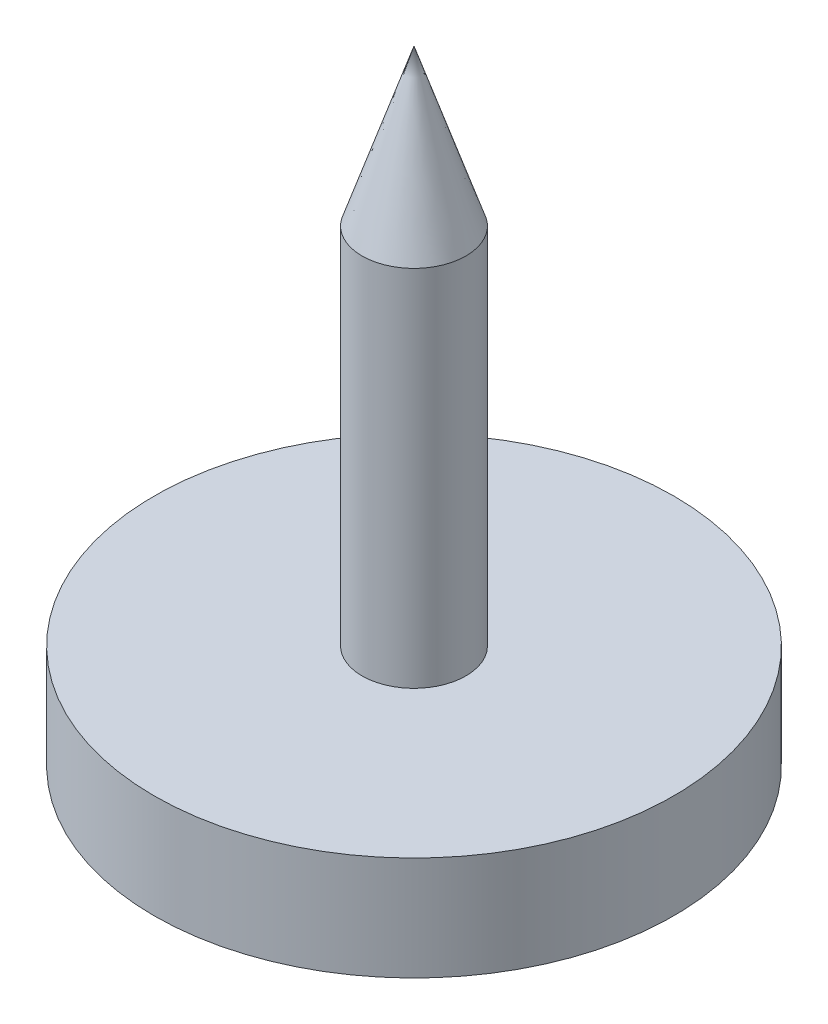
ISO-10303-21;
HEADER;
FILE_DESCRIPTION(('STEP AP214'),'2;1');
FILE_NAME('part.step','',(''),(''),'','','');
FILE_SCHEMA(('AUTOMOTIVE_DESIGN { 1 0 10303 214 1 1 1 1 }'));
ENDSEC;
DATA;
#1=APPLICATION_CONTEXT('core data for automotive mechanical design processes');
#2=APPLICATION_PROTOCOL_DEFINITION('international standard','automotive_design',2000,#1);
#3=PRODUCT_CONTEXT('',#1,'mechanical');
#4=PRODUCT('Part','Part','',(#3));
#5=PRODUCT_RELATED_PRODUCT_CATEGORY('part','',(#4));
#6=PRODUCT_DEFINITION_FORMATION('','',#4);
#7=PRODUCT_DEFINITION_CONTEXT('part definition',#1,'design');
#8=PRODUCT_DEFINITION('design','',#6,#7);
#9=PRODUCT_DEFINITION_SHAPE('','',#8);
#10=(LENGTH_UNIT() NAMED_UNIT(*) SI_UNIT(.MILLI.,.METRE.));
#11=(NAMED_UNIT(*) PLANE_ANGLE_UNIT() SI_UNIT($,.RADIAN.));
#12=(NAMED_UNIT(*) SI_UNIT($,.STERADIAN.) SOLID_ANGLE_UNIT());
#13=UNCERTAINTY_MEASURE_WITH_UNIT(LENGTH_MEASURE(1.E-05),#10,'distance_accuracy_value','');
#14=(GEOMETRIC_REPRESENTATION_CONTEXT(3) GLOBAL_UNCERTAINTY_ASSIGNED_CONTEXT((#13)) GLOBAL_UNIT_ASSIGNED_CONTEXT((#10,
#11,#12)) REPRESENTATION_CONTEXT('',''));
#15=CARTESIAN_POINT('',(0.,0.,0.));
#16=DIRECTION('',(0.,0.,1.));
#17=DIRECTION('',(1.,0.,0.));
#18=AXIS2_PLACEMENT_3D('',#15,#16,#17);
#19=CARTESIAN_POINT('',(0.,20.,0.));
#20=DIRECTION('',(0.,-1.,0.));
#21=DIRECTION('',(0.,0.,-1.));
#22=AXIS2_PLACEMENT_3D('',#19,#20,#21);
#23=CYLINDRICAL_SURFACE('',#22,50.);
#24=CARTESIAN_POINT('',(0.,20.,0.));
#25=DIRECTION('',(0.,1.,0.));
#26=DIRECTION('',(0.,0.,1.));
#27=AXIS2_PLACEMENT_3D('',#24,#25,#26);
#28=CIRCLE('',#27,50.);
#29=CARTESIAN_POINT('',(0.,20.,50.));
#30=VERTEX_POINT('',#29);
#31=EDGE_CURVE('E42',#30,#30,#28,.T.);
#32=ORIENTED_EDGE('',*,*,#31,.F.);
#33=EDGE_LOOP('',(#32));
#34=FACE_BOUND('',#33,.T.);
#35=CARTESIAN_POINT('',(0.,0.,0.));
#36=DIRECTION('',(0.,1.,0.));
#37=DIRECTION('',(0.,0.,1.));
#38=AXIS2_PLACEMENT_3D('',#35,#36,#37);
#39=CIRCLE('',#38,50.);
#40=CARTESIAN_POINT('',(0.,0.,50.));
#41=VERTEX_POINT('',#40);
#42=EDGE_CURVE('E38',#41,#41,#39,.T.);
#43=ORIENTED_EDGE('',*,*,#42,.T.);
#44=EDGE_LOOP('',(#43));
#45=FACE_BOUND('',#44,.T.);
#46=ADVANCED_FACE('F35',(#34,#45),#23,.T.);
#47=CARTESIAN_POINT('',(0.,20.,0.));
#48=DIRECTION('',(0.,1.,0.));
#49=DIRECTION('',(0.,0.,1.));
#50=AXIS2_PLACEMENT_3D('',#47,#48,#49);
#51=PLANE('',#50);
#52=CARTESIAN_POINT('',(0.,20.,0.));
#53=DIRECTION('',(0.,1.,0.));
#54=DIRECTION('',(0.,0.,1.));
#55=AXIS2_PLACEMENT_3D('',#52,#53,#54);
#56=CIRCLE('',#55,10.);
#57=CARTESIAN_POINT('',(0.,20.,10.));
#58=VERTEX_POINT('',#57);
#59=EDGE_CURVE('E11',#58,#58,#56,.T.);
#60=ORIENTED_EDGE('',*,*,#59,.F.);
#61=EDGE_LOOP('',(#60));
#62=FACE_BOUND('',#61,.T.);
#63=ORIENTED_EDGE('',*,*,#31,.T.);
#64=EDGE_LOOP('',(#63));
#65=FACE_BOUND('',#64,.T.);
#66=ADVANCED_FACE('F60',(#62,#65),#51,.T.);
#67=CARTESIAN_POINT('',(0.,0.,0.));
#68=DIRECTION('',(0.,1.,0.));
#69=DIRECTION('',(0.,0.,1.));
#70=AXIS2_PLACEMENT_3D('',#67,#68,#69);
#71=PLANE('',#70);
#72=ORIENTED_EDGE('',*,*,#42,.F.);
#73=EDGE_LOOP('',(#72));
#74=FACE_BOUND('',#73,.T.);
#75=ADVANCED_FACE('F66',(#74),#71,.F.);
#76=CARTESIAN_POINT('',(0.,90.,0.));
#77=DIRECTION('',(0.,-1.,0.));
#78=DIRECTION('',(0.,0.,-1.));
#79=AXIS2_PLACEMENT_3D('',#76,#77,#78);
#80=CYLINDRICAL_SURFACE('',#79,10.);
#81=CARTESIAN_POINT('',(0.,90.,0.));
#82=DIRECTION('',(0.,1.,0.));
#83=DIRECTION('',(0.,0.,1.));
#84=AXIS2_PLACEMENT_3D('',#81,#82,#83);
#85=CIRCLE('',#84,10.);
#86=CARTESIAN_POINT('',(0.,90.,10.));
#87=VERTEX_POINT('',#86);
#88=EDGE_CURVE('E53',#87,#87,#85,.T.);
#89=ORIENTED_EDGE('',*,*,#88,.F.);
#90=EDGE_LOOP('',(#89));
#91=FACE_BOUND('',#90,.T.);
#92=ORIENTED_EDGE('',*,*,#59,.T.);
#93=EDGE_LOOP('',(#92));
#94=FACE_BOUND('',#93,.T.);
#95=ADVANCED_FACE('F49',(#91,#94),#80,.T.);
#96=CARTESIAN_POINT('',(0.,90.,0.));
#97=DIRECTION('',(0.,-1.,0.));
#98=DIRECTION('',(0.,0.,-1.));
#99=AXIS2_PLACEMENT_3D('',#96,#97,#98);
#100=CONICAL_SURFACE('',#99,10.,0.321750554396642);
#101=CARTESIAN_POINT('',(0.,120.,0.));
#102=VERTEX_POINT('',#101);
#103=VERTEX_LOOP('',#102);
#104=FACE_BOUND('',#103,.T.);
#105=ORIENTED_EDGE('',*,*,#88,.T.);
#106=EDGE_LOOP('',(#105));
#107=FACE_BOUND('',#106,.T.);
#108=ADVANCED_FACE('F46',(#104,#107),#100,.T.);
#109=CLOSED_SHELL('',(#46,#66,#75,#95,#108));
#110=MANIFOLD_SOLID_BREP('B2',#109);
#111=ADVANCED_BREP_SHAPE_REPRESENTATION('',(#18,#110),#14);
#112=SHAPE_DEFINITION_REPRESENTATION(#9,#111);
ENDSEC;
END-ISO-10303-21;
